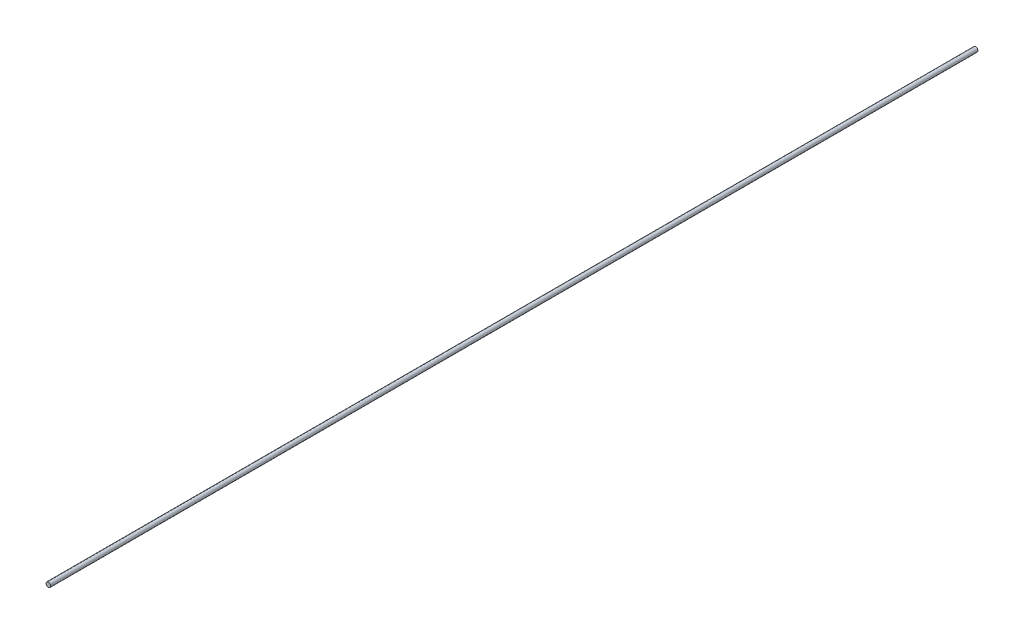
ISO-10303-21;
HEADER;
FILE_DESCRIPTION(('STEP AP214'),'2;1');
FILE_NAME('part.step','',(''),(''),'','','');
FILE_SCHEMA(('AUTOMOTIVE_DESIGN { 1 0 10303 214 1 1 1 1 }'));
ENDSEC;
DATA;
#1=APPLICATION_CONTEXT('core data for automotive mechanical design processes');
#2=APPLICATION_PROTOCOL_DEFINITION('international standard','automotive_design',2000,#1);
#3=PRODUCT_CONTEXT('',#1,'mechanical');
#4=PRODUCT('Part','Part','',(#3));
#5=PRODUCT_RELATED_PRODUCT_CATEGORY('part','',(#4));
#6=PRODUCT_DEFINITION_FORMATION('','',#4);
#7=PRODUCT_DEFINITION_CONTEXT('part definition',#1,'design');
#8=PRODUCT_DEFINITION('design','',#6,#7);
#9=PRODUCT_DEFINITION_SHAPE('','',#8);
#10=(LENGTH_UNIT() NAMED_UNIT(*) SI_UNIT(.MILLI.,.METRE.));
#11=(NAMED_UNIT(*) PLANE_ANGLE_UNIT() SI_UNIT($,.RADIAN.));
#12=(NAMED_UNIT(*) SI_UNIT($,.STERADIAN.) SOLID_ANGLE_UNIT());
#13=UNCERTAINTY_MEASURE_WITH_UNIT(LENGTH_MEASURE(1.E-05),#10,'distance_accuracy_value','');
#14=(GEOMETRIC_REPRESENTATION_CONTEXT(3) GLOBAL_UNCERTAINTY_ASSIGNED_CONTEXT((#13)) GLOBAL_UNIT_ASSIGNED_CONTEXT((#10,
#11,#12)) REPRESENTATION_CONTEXT('',''));
#15=CARTESIAN_POINT('',(0.,0.,0.));
#16=DIRECTION('',(0.,0.,1.));
#17=DIRECTION('',(1.,0.,0.));
#18=AXIS2_PLACEMENT_3D('',#15,#16,#17);
#19=CARTESIAN_POINT('',(0.,0.,1000.467));
#20=DIRECTION('',(0.,0.,-1.));
#21=DIRECTION('',(-1.,0.,0.));
#22=AXIS2_PLACEMENT_3D('',#19,#20,#21);
#23=CYLINDRICAL_SURFACE('',#22,5.);
#24=CARTESIAN_POINT('',(0.,0.,1000.467));
#25=DIRECTION('',(0.,0.,1.));
#26=DIRECTION('',(1.,0.,0.));
#27=AXIS2_PLACEMENT_3D('',#24,#25,#26);
#28=CIRCLE('',#27,5.);
#29=CARTESIAN_POINT('',(5.,0.,1000.467));
#30=VERTEX_POINT('',#29);
#31=EDGE_CURVE('E10',#30,#30,#28,.T.);
#32=ORIENTED_EDGE('',*,*,#31,.F.);
#33=EDGE_LOOP('',(#32));
#34=FACE_BOUND('',#33,.T.);
#35=CARTESIAN_POINT('',(0.,0.,-1000.467));
#36=DIRECTION('',(0.,0.,1.));
#37=DIRECTION('',(1.,0.,0.));
#38=AXIS2_PLACEMENT_3D('',#35,#36,#37);
#39=CIRCLE('',#38,5.);
#40=CARTESIAN_POINT('',(5.,0.,-1000.467));
#41=VERTEX_POINT('',#40);
#42=EDGE_CURVE('E37',#41,#41,#39,.T.);
#43=ORIENTED_EDGE('',*,*,#42,.T.);
#44=EDGE_LOOP('',(#43));
#45=FACE_BOUND('',#44,.T.);
#46=ADVANCED_FACE('F31',(#34,#45),#23,.T.);
#47=CARTESIAN_POINT('',(0.,0.,1000.467));
#48=DIRECTION('',(0.,0.,1.));
#49=DIRECTION('',(1.,0.,0.));
#50=AXIS2_PLACEMENT_3D('',#47,#48,#49);
#51=PLANE('',#50);
#52=ORIENTED_EDGE('',*,*,#31,.T.);
#53=EDGE_LOOP('',(#52));
#54=FACE_BOUND('',#53,.T.);
#55=ADVANCED_FACE('F46',(#54),#51,.T.);
#56=CARTESIAN_POINT('',(0.,0.,-1000.467));
#57=DIRECTION('',(0.,0.,-1.));
#58=DIRECTION('',(1.,0.,0.));
#59=AXIS2_PLACEMENT_3D('',#56,#57,#58);
#60=PLANE('',#59);
#61=ORIENTED_EDGE('',*,*,#42,.F.);
#62=EDGE_LOOP('',(#61));
#63=FACE_BOUND('',#62,.T.);
#64=ADVANCED_FACE('F44',(#63),#60,.T.);
#65=CLOSED_SHELL('',(#46,#55,#64));
#66=MANIFOLD_SOLID_BREP('B2',#65);
#67=ADVANCED_BREP_SHAPE_REPRESENTATION('',(#18,#66),#14);
#68=SHAPE_DEFINITION_REPRESENTATION(#9,#67);
ENDSEC;
END-ISO-10303-21;
